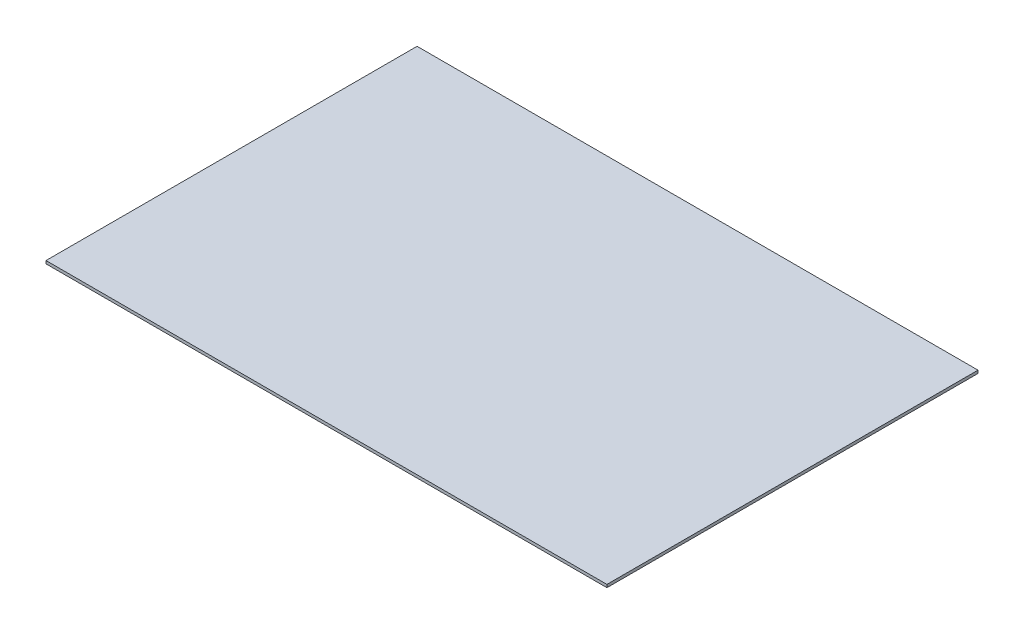
ISO-10303-21;
HEADER;
FILE_DESCRIPTION(('STEP AP214'),'2;1');
FILE_NAME('part.step','',(''),(''),'','','');
FILE_SCHEMA(('AUTOMOTIVE_DESIGN { 1 0 10303 214 1 1 1 1 }'));
ENDSEC;
DATA;
#1=APPLICATION_CONTEXT('core data for automotive mechanical design processes');
#2=APPLICATION_PROTOCOL_DEFINITION('international standard','automotive_design',2000,#1);
#3=PRODUCT_CONTEXT('',#1,'mechanical');
#4=PRODUCT('Part','Part','',(#3));
#5=PRODUCT_RELATED_PRODUCT_CATEGORY('part','',(#4));
#6=PRODUCT_DEFINITION_FORMATION('','',#4);
#7=PRODUCT_DEFINITION_CONTEXT('part definition',#1,'design');
#8=PRODUCT_DEFINITION('design','',#6,#7);
#9=PRODUCT_DEFINITION_SHAPE('','',#8);
#10=(LENGTH_UNIT() NAMED_UNIT(*) SI_UNIT(.MILLI.,.METRE.));
#11=(NAMED_UNIT(*) PLANE_ANGLE_UNIT() SI_UNIT($,.RADIAN.));
#12=(NAMED_UNIT(*) SI_UNIT($,.STERADIAN.) SOLID_ANGLE_UNIT());
#13=UNCERTAINTY_MEASURE_WITH_UNIT(LENGTH_MEASURE(1.E-05),#10,'distance_accuracy_value','');
#14=(GEOMETRIC_REPRESENTATION_CONTEXT(3) GLOBAL_UNCERTAINTY_ASSIGNED_CONTEXT((#13)) GLOBAL_UNIT_ASSIGNED_CONTEXT((#10,
#11,#12)) REPRESENTATION_CONTEXT('',''));
#15=CARTESIAN_POINT('',(0.,0.,0.));
#16=DIRECTION('',(0.,0.,1.));
#17=DIRECTION('',(1.,0.,0.));
#18=AXIS2_PLACEMENT_3D('',#15,#16,#17);
#19=CARTESIAN_POINT('',(195.,2.,-130.5));
#20=DIRECTION('',(-1.,0.,0.));
#21=DIRECTION('',(0.,0.,1.));
#22=AXIS2_PLACEMENT_3D('',#19,#20,#21);
#23=PLANE('',#22);
#24=DIRECTION('',(0.,0.,-1.));
#25=VECTOR('',#24,1.);
#26=CARTESIAN_POINT('',(195.,0.,-130.5));
#27=LINE('',#26,#25);
#28=CARTESIAN_POINT('',(195.,0.,127.5));
#29=VERTEX_POINT('',#28);
#30=CARTESIAN_POINT('',(195.,0.,-130.5));
#31=VERTEX_POINT('',#30);
#32=EDGE_CURVE('E96',#29,#31,#27,.T.);
#33=ORIENTED_EDGE('',*,*,#32,.T.);
#34=DIRECTION('',(0.,-1.,0.));
#35=VECTOR('',#34,1.);
#36=CARTESIAN_POINT('',(195.,2.,-130.5));
#37=LINE('',#36,#35);
#38=CARTESIAN_POINT('',(195.,2.,-130.5));
#39=VERTEX_POINT('',#38);
#40=EDGE_CURVE('E11',#39,#31,#37,.T.);
#41=ORIENTED_EDGE('',*,*,#40,.F.);
#42=DIRECTION('',(0.,0.,-1.));
#43=VECTOR('',#42,1.);
#44=CARTESIAN_POINT('',(195.,2.,-130.5));
#45=LINE('',#44,#43);
#46=CARTESIAN_POINT('',(195.,2.,127.5));
#47=VERTEX_POINT('',#46);
#48=EDGE_CURVE('E84',#47,#39,#45,.T.);
#49=ORIENTED_EDGE('',*,*,#48,.F.);
#50=DIRECTION('',(0.,-1.,0.));
#51=VECTOR('',#50,1.);
#52=CARTESIAN_POINT('',(195.,2.,127.5));
#53=LINE('',#52,#51);
#54=EDGE_CURVE('E92',#47,#29,#53,.T.);
#55=ORIENTED_EDGE('',*,*,#54,.T.);
#56=EDGE_LOOP('',(#33,#41,#49,#55));
#57=FACE_BOUND('',#56,.T.);
#58=ADVANCED_FACE('F33',(#57),#23,.F.);
#59=CARTESIAN_POINT('',(-195.,2.,-130.5));
#60=DIRECTION('',(0.,0.,1.));
#61=DIRECTION('',(1.,0.,0.));
#62=AXIS2_PLACEMENT_3D('',#59,#60,#61);
#63=PLANE('',#62);
#64=DIRECTION('',(-1.,0.,0.));
#65=VECTOR('',#64,1.);
#66=CARTESIAN_POINT('',(-195.,0.,-130.5));
#67=LINE('',#66,#65);
#68=CARTESIAN_POINT('',(-195.,0.,-130.5));
#69=VERTEX_POINT('',#68);
#70=EDGE_CURVE('E88',#31,#69,#67,.T.);
#71=ORIENTED_EDGE('',*,*,#70,.T.);
#72=DIRECTION('',(0.,-1.,0.));
#73=VECTOR('',#72,1.);
#74=CARTESIAN_POINT('',(-195.,2.,-130.5));
#75=LINE('',#74,#73);
#76=CARTESIAN_POINT('',(-195.,2.,-130.5));
#77=VERTEX_POINT('',#76);
#78=EDGE_CURVE('E41',#77,#69,#75,.T.);
#79=ORIENTED_EDGE('',*,*,#78,.F.);
#80=DIRECTION('',(-1.,0.,0.));
#81=VECTOR('',#80,1.);
#82=CARTESIAN_POINT('',(-195.,2.,-130.5));
#83=LINE('',#82,#81);
#84=EDGE_CURVE('E79',#39,#77,#83,.T.);
#85=ORIENTED_EDGE('',*,*,#84,.F.);
#86=ORIENTED_EDGE('',*,*,#40,.T.);
#87=EDGE_LOOP('',(#71,#79,#85,#86));
#88=FACE_BOUND('',#87,.T.);
#89=ADVANCED_FACE('F87',(#88),#63,.F.);
#90=CARTESIAN_POINT('',(-195.,2.,-130.5));
#91=DIRECTION('',(1.,0.,0.));
#92=DIRECTION('',(0.,0.,-1.));
#93=AXIS2_PLACEMENT_3D('',#90,#91,#92);
#94=PLANE('',#93);
#95=DIRECTION('',(0.,0.,1.));
#96=VECTOR('',#95,1.);
#97=CARTESIAN_POINT('',(-195.,0.,-130.5));
#98=LINE('',#97,#96);
#99=CARTESIAN_POINT('',(-195.,0.,127.5));
#100=VERTEX_POINT('',#99);
#101=EDGE_CURVE('E66',#69,#100,#98,.T.);
#102=ORIENTED_EDGE('',*,*,#101,.T.);
#103=DIRECTION('',(0.,-1.,0.));
#104=VECTOR('',#103,1.);
#105=CARTESIAN_POINT('',(-195.,2.,127.5));
#106=LINE('',#105,#104);
#107=CARTESIAN_POINT('',(-195.,2.,127.5));
#108=VERTEX_POINT('',#107);
#109=EDGE_CURVE('E89',#108,#100,#106,.T.);
#110=ORIENTED_EDGE('',*,*,#109,.F.);
#111=DIRECTION('',(0.,0.,1.));
#112=VECTOR('',#111,1.);
#113=CARTESIAN_POINT('',(-195.,2.,-130.5));
#114=LINE('',#113,#112);
#115=EDGE_CURVE('E82',#77,#108,#114,.T.);
#116=ORIENTED_EDGE('',*,*,#115,.F.);
#117=ORIENTED_EDGE('',*,*,#78,.T.);
#118=EDGE_LOOP('',(#102,#110,#116,#117));
#119=FACE_BOUND('',#118,.T.);
#120=ADVANCED_FACE('F90',(#119),#94,.F.);
#121=CARTESIAN_POINT('',(-195.,2.,127.5));
#122=DIRECTION('',(0.,0.,-1.));
#123=DIRECTION('',(-1.,0.,0.));
#124=AXIS2_PLACEMENT_3D('',#121,#122,#123);
#125=PLANE('',#124);
#126=DIRECTION('',(1.,0.,0.));
#127=VECTOR('',#126,1.);
#128=CARTESIAN_POINT('',(-195.,0.,127.5));
#129=LINE('',#128,#127);
#130=EDGE_CURVE('E72',#100,#29,#129,.T.);
#131=ORIENTED_EDGE('',*,*,#130,.T.);
#132=ORIENTED_EDGE('',*,*,#54,.F.);
#133=DIRECTION('',(1.,0.,0.));
#134=VECTOR('',#133,1.);
#135=CARTESIAN_POINT('',(-195.,2.,127.5));
#136=LINE('',#135,#134);
#137=EDGE_CURVE('E49',#108,#47,#136,.T.);
#138=ORIENTED_EDGE('',*,*,#137,.F.);
#139=ORIENTED_EDGE('',*,*,#109,.T.);
#140=EDGE_LOOP('',(#131,#132,#138,#139));
#141=FACE_BOUND('',#140,.T.);
#142=ADVANCED_FACE('F103',(#141),#125,.F.);
#143=CARTESIAN_POINT('',(0.,2.,0.));
#144=DIRECTION('',(0.,1.,0.));
#145=DIRECTION('',(0.,0.,1.));
#146=AXIS2_PLACEMENT_3D('',#143,#144,#145);
#147=PLANE('',#146);
#148=ORIENTED_EDGE('',*,*,#48,.T.);
#149=ORIENTED_EDGE('',*,*,#84,.T.);
#150=ORIENTED_EDGE('',*,*,#115,.T.);
#151=ORIENTED_EDGE('',*,*,#137,.T.);
#152=EDGE_LOOP('',(#148,#149,#150,#151));
#153=FACE_BOUND('',#152,.T.);
#154=ADVANCED_FACE('F80',(#153),#147,.T.);
#155=CARTESIAN_POINT('',(0.,0.,0.));
#156=DIRECTION('',(0.,1.,0.));
#157=DIRECTION('',(0.,0.,1.));
#158=AXIS2_PLACEMENT_3D('',#155,#156,#157);
#159=PLANE('',#158);
#160=ORIENTED_EDGE('',*,*,#32,.F.);
#161=ORIENTED_EDGE('',*,*,#130,.F.);
#162=ORIENTED_EDGE('',*,*,#101,.F.);
#163=ORIENTED_EDGE('',*,*,#70,.F.);
#164=EDGE_LOOP('',(#160,#161,#162,#163));
#165=FACE_BOUND('',#164,.T.);
#166=ADVANCED_FACE('F106',(#165),#159,.F.);
#167=CLOSED_SHELL('',(#58,#89,#120,#142,#154,#166));
#168=MANIFOLD_SOLID_BREP('B2',#167);
#169=ADVANCED_BREP_SHAPE_REPRESENTATION('',(#18,#168),#14);
#170=SHAPE_DEFINITION_REPRESENTATION(#9,#169);
ENDSEC;
END-ISO-10303-21;
